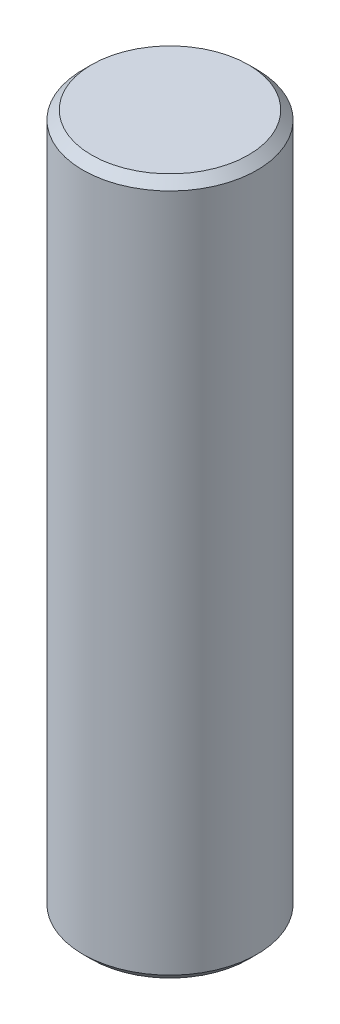
ISO-10303-21;
HEADER;
FILE_DESCRIPTION(('STEP AP214'),'2;1');
FILE_NAME('part.step','',(''),(''),'','','');
FILE_SCHEMA(('AUTOMOTIVE_DESIGN { 1 0 10303 214 1 1 1 1 }'));
ENDSEC;
DATA;
#1=APPLICATION_CONTEXT('core data for automotive mechanical design processes');
#2=APPLICATION_PROTOCOL_DEFINITION('international standard','automotive_design',2000,#1);
#3=PRODUCT_CONTEXT('',#1,'mechanical');
#4=PRODUCT('Part','Part','',(#3));
#5=PRODUCT_RELATED_PRODUCT_CATEGORY('part','',(#4));
#6=PRODUCT_DEFINITION_FORMATION('','',#4);
#7=PRODUCT_DEFINITION_CONTEXT('part definition',#1,'design');
#8=PRODUCT_DEFINITION('design','',#6,#7);
#9=PRODUCT_DEFINITION_SHAPE('','',#8);
#10=(LENGTH_UNIT() NAMED_UNIT(*) SI_UNIT(.MILLI.,.METRE.));
#11=(NAMED_UNIT(*) PLANE_ANGLE_UNIT() SI_UNIT($,.RADIAN.));
#12=(NAMED_UNIT(*) SI_UNIT($,.STERADIAN.) SOLID_ANGLE_UNIT());
#13=UNCERTAINTY_MEASURE_WITH_UNIT(LENGTH_MEASURE(1.E-05),#10,'distance_accuracy_value','');
#14=(GEOMETRIC_REPRESENTATION_CONTEXT(3) GLOBAL_UNCERTAINTY_ASSIGNED_CONTEXT((#13)) GLOBAL_UNIT_ASSIGNED_CONTEXT((#10,
#11,#12)) REPRESENTATION_CONTEXT('',''));
#15=CARTESIAN_POINT('',(0.,0.,0.));
#16=DIRECTION('',(0.,0.,1.));
#17=DIRECTION('',(1.,0.,0.));
#18=AXIS2_PLACEMENT_3D('',#15,#16,#17);
#19=CARTESIAN_POINT('',(0.,8.,0.));
#20=DIRECTION('',(0.,-1.,0.));
#21=DIRECTION('',(0.,0.,-1.));
#22=AXIS2_PLACEMENT_3D('',#19,#20,#21);
#23=CYLINDRICAL_SURFACE('',#22,1.);
#24=CARTESIAN_POINT('',(0.,0.0999999999999994,0.));
#25=DIRECTION('',(0.,1.,0.));
#26=DIRECTION('',(0.,0.,1.));
#27=AXIS2_PLACEMENT_3D('',#24,#25,#26);
#28=CIRCLE('',#27,1.);
#29=CARTESIAN_POINT('',(0.,0.0999999999999994,1.));
#30=VERTEX_POINT('',#29);
#31=EDGE_CURVE('E49',#30,#30,#28,.T.);
#32=ORIENTED_EDGE('',*,*,#31,.T.);
#33=EDGE_LOOP('',(#32));
#34=FACE_BOUND('',#33,.T.);
#35=CARTESIAN_POINT('',(0.,7.9,0.));
#36=DIRECTION('',(0.,1.,0.));
#37=DIRECTION('',(0.,0.,1.));
#38=AXIS2_PLACEMENT_3D('',#35,#36,#37);
#39=CIRCLE('',#38,1.);
#40=CARTESIAN_POINT('',(0.,7.9,1.));
#41=VERTEX_POINT('',#40);
#42=EDGE_CURVE('E53',#41,#41,#39,.F.);
#43=ORIENTED_EDGE('',*,*,#42,.T.);
#44=EDGE_LOOP('',(#43));
#45=FACE_BOUND('',#44,.T.);
#46=ADVANCED_FACE('F37',(#34,#45),#23,.T.);
#47=CARTESIAN_POINT('',(0.,8.,0.));
#48=DIRECTION('',(0.,1.,0.));
#49=DIRECTION('',(0.,0.,1.));
#50=AXIS2_PLACEMENT_3D('',#47,#48,#49);
#51=PLANE('',#50);
#52=CARTESIAN_POINT('',(0.,8.,0.));
#53=DIRECTION('',(0.,1.,0.));
#54=DIRECTION('',(0.,0.,1.));
#55=AXIS2_PLACEMENT_3D('',#52,#53,#54);
#56=CIRCLE('',#55,0.9);
#57=CARTESIAN_POINT('',(0.,8.,0.9));
#58=VERTEX_POINT('',#57);
#59=EDGE_CURVE('E10',#58,#58,#56,.T.);
#60=ORIENTED_EDGE('',*,*,#59,.T.);
#61=EDGE_LOOP('',(#60));
#62=FACE_BOUND('',#61,.T.);
#63=ADVANCED_FACE('F69',(#62),#51,.T.);
#64=CARTESIAN_POINT('',(0.,0.,0.));
#65=DIRECTION('',(0.,1.,0.));
#66=DIRECTION('',(0.,0.,1.));
#67=AXIS2_PLACEMENT_3D('',#64,#65,#66);
#68=PLANE('',#67);
#69=CARTESIAN_POINT('',(0.,0.,0.));
#70=DIRECTION('',(0.,1.,0.));
#71=DIRECTION('',(0.,0.,1.));
#72=AXIS2_PLACEMENT_3D('',#69,#70,#71);
#73=CIRCLE('',#72,0.900000000000001);
#74=CARTESIAN_POINT('',(0.,0.,0.900000000000001));
#75=VERTEX_POINT('',#74);
#76=EDGE_CURVE('E45',#75,#75,#73,.F.);
#77=ORIENTED_EDGE('',*,*,#76,.T.);
#78=EDGE_LOOP('',(#77));
#79=FACE_BOUND('',#78,.T.);
#80=ADVANCED_FACE('F66',(#79),#68,.F.);
#81=CARTESIAN_POINT('',(0.,0.0999999999999994,0.));
#82=DIRECTION('',(0.,1.,0.));
#83=DIRECTION('',(0.,0.,1.));
#84=AXIS2_PLACEMENT_3D('',#81,#82,#83);
#85=CONICAL_SURFACE('',#84,1.,0.785398163397448);
#86=ORIENTED_EDGE('',*,*,#76,.F.);
#87=EDGE_LOOP('',(#86));
#88=FACE_BOUND('',#87,.T.);
#89=ORIENTED_EDGE('',*,*,#31,.F.);
#90=EDGE_LOOP('',(#89));
#91=FACE_BOUND('',#90,.T.);
#92=ADVANCED_FACE('F62',(#88,#91),#85,.T.);
#93=CARTESIAN_POINT('',(0.,8.,0.));
#94=DIRECTION('',(0.,-1.,0.));
#95=DIRECTION('',(0.,0.,-1.));
#96=AXIS2_PLACEMENT_3D('',#93,#94,#95);
#97=CONICAL_SURFACE('',#96,0.9,0.785398163397453);
#98=ORIENTED_EDGE('',*,*,#42,.F.);
#99=EDGE_LOOP('',(#98));
#100=FACE_BOUND('',#99,.T.);
#101=ORIENTED_EDGE('',*,*,#59,.F.);
#102=EDGE_LOOP('',(#101));
#103=FACE_BOUND('',#102,.T.);
#104=ADVANCED_FACE('F40',(#100,#103),#97,.T.);
#105=CLOSED_SHELL('',(#46,#63,#80,#92,#104));
#106=MANIFOLD_SOLID_BREP('B2',#105);
#107=ADVANCED_BREP_SHAPE_REPRESENTATION('',(#18,#106),#14);
#108=SHAPE_DEFINITION_REPRESENTATION(#9,#107);
ENDSEC;
END-ISO-10303-21;
